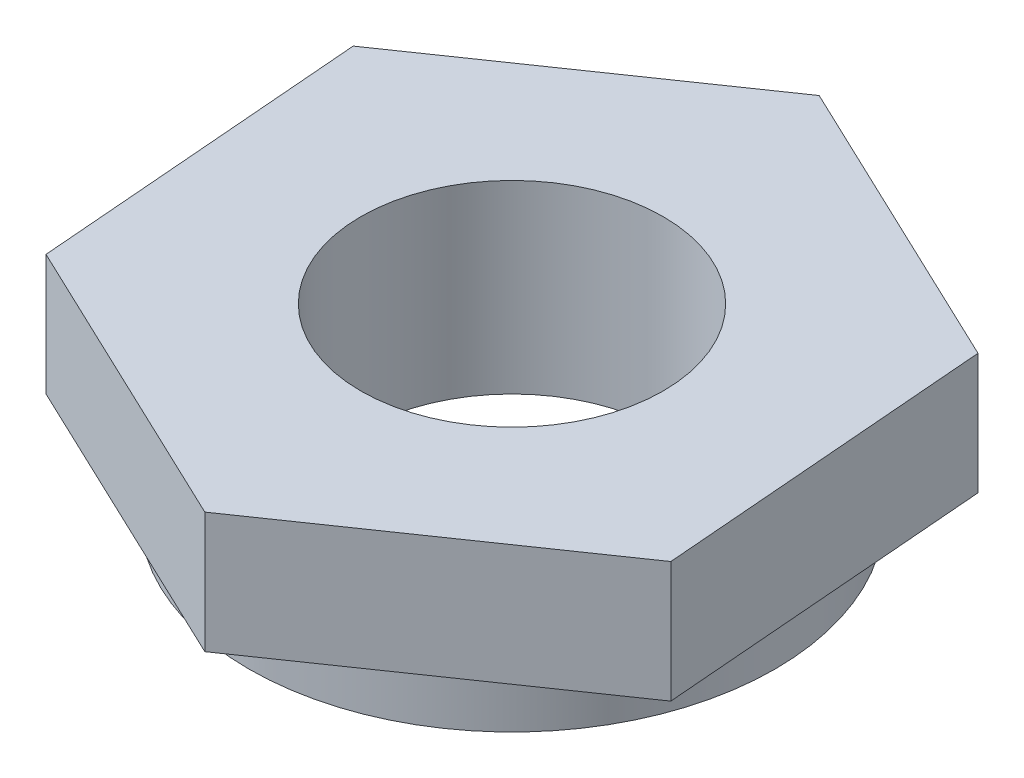
ISO-10303-21;
HEADER;
FILE_DESCRIPTION(('STEP AP214'),'2;1');
FILE_NAME('part.step','',(''),(''),'','','');
FILE_SCHEMA(('AUTOMOTIVE_DESIGN { 1 0 10303 214 1 1 1 1 }'));
ENDSEC;
DATA;
#1=APPLICATION_CONTEXT('core data for automotive mechanical design processes');
#2=APPLICATION_PROTOCOL_DEFINITION('international standard','automotive_design',2000,#1);
#3=PRODUCT_CONTEXT('',#1,'mechanical');
#4=PRODUCT('Part','Part','',(#3));
#5=PRODUCT_RELATED_PRODUCT_CATEGORY('part','',(#4));
#6=PRODUCT_DEFINITION_FORMATION('','',#4);
#7=PRODUCT_DEFINITION_CONTEXT('part definition',#1,'design');
#8=PRODUCT_DEFINITION('design','',#6,#7);
#9=PRODUCT_DEFINITION_SHAPE('','',#8);
#10=(LENGTH_UNIT() NAMED_UNIT(*) SI_UNIT(.MILLI.,.METRE.));
#11=(NAMED_UNIT(*) PLANE_ANGLE_UNIT() SI_UNIT($,.RADIAN.));
#12=(NAMED_UNIT(*) SI_UNIT($,.STERADIAN.) SOLID_ANGLE_UNIT());
#13=UNCERTAINTY_MEASURE_WITH_UNIT(LENGTH_MEASURE(1.E-05),#10,'distance_accuracy_value','');
#14=(GEOMETRIC_REPRESENTATION_CONTEXT(3) GLOBAL_UNCERTAINTY_ASSIGNED_CONTEXT((#13)) GLOBAL_UNIT_ASSIGNED_CONTEXT((#10,
#11,#12)) REPRESENTATION_CONTEXT('',''));
#15=CARTESIAN_POINT('',(0.,0.,0.));
#16=DIRECTION('',(0.,0.,1.));
#17=DIRECTION('',(1.,0.,0.));
#18=AXIS2_PLACEMENT_3D('',#15,#16,#17);
#19=CARTESIAN_POINT('',(0.221601351525087,1.,2.76240707373158));
#20=DIRECTION('',(-0.567649318486044,0.,-0.823270460554932));
#21=DIRECTION('',(-0.823270460554932,0.,0.567649318486044));
#22=AXIS2_PLACEMENT_3D('',#19,#20,#21);
#23=PLANE('',#22);
#24=DIRECTION('',(0.823270460554932,0.,-0.567649318486044));
#25=VECTOR('',#24,1.);
#26=CARTESIAN_POINT('',(0.221601351525087,0.,2.76240707373158));
#27=LINE('',#26,#25);
#28=CARTESIAN_POINT('',(0.221601351525087,0.,2.76240707373158));
#29=VERTEX_POINT('',#28);
#30=CARTESIAN_POINT('',(2.50311537720792,0.,1.1892911369321));
#31=VERTEX_POINT('',#30);
#32=EDGE_CURVE('E121',#29,#31,#27,.T.);
#33=ORIENTED_EDGE('',*,*,#32,.T.);
#34=DIRECTION('',(0.,-1.,0.));
#35=VECTOR('',#34,1.);
#36=CARTESIAN_POINT('',(2.50311537720792,1.,1.1892911369321));
#37=LINE('',#36,#35);
#38=CARTESIAN_POINT('',(2.50311537720792,1.,1.1892911369321));
#39=VERTEX_POINT('',#38);
#40=EDGE_CURVE('E38',#39,#31,#37,.T.);
#41=ORIENTED_EDGE('',*,*,#40,.F.);
#42=DIRECTION('',(0.823270460554932,0.,-0.567649318486044));
#43=VECTOR('',#42,1.);
#44=CARTESIAN_POINT('',(0.221601351525087,1.,2.76240707373158));
#45=LINE('',#44,#43);
#46=CARTESIAN_POINT('',(0.221601351525087,1.,2.76240707373158));
#47=VERTEX_POINT('',#46);
#48=EDGE_CURVE('E132',#47,#39,#45,.T.);
#49=ORIENTED_EDGE('',*,*,#48,.F.);
#50=DIRECTION('',(0.,-1.,0.));
#51=VECTOR('',#50,1.);
#52=CARTESIAN_POINT('',(0.221601351525087,1.,2.76240707373158));
#53=LINE('',#52,#51);
#54=EDGE_CURVE('E117',#47,#29,#53,.T.);
#55=ORIENTED_EDGE('',*,*,#54,.T.);
#56=EDGE_LOOP('',(#33,#41,#49,#55));
#57=FACE_BOUND('',#56,.T.);
#58=ADVANCED_FACE('F35',(#57),#23,.F.);
#59=CARTESIAN_POINT('',(2.50311537720792,1.,1.1892911369321));
#60=DIRECTION('',(-0.996797792268908,0.,0.0799634999723713));
#61=DIRECTION('',(0.0799634999723713,0.,0.996797792268908));
#62=AXIS2_PLACEMENT_3D('',#59,#60,#61);
#63=PLANE('',#62);
#64=DIRECTION('',(-0.0799634999723713,0.,-0.996797792268908));
#65=VECTOR('',#64,1.);
#66=CARTESIAN_POINT('',(2.50311537720792,0.,1.1892911369321));
#67=LINE('',#66,#65);
#68=CARTESIAN_POINT('',(2.28151402568283,0.,-1.57311593679948));
#69=VERTEX_POINT('',#68);
#70=EDGE_CURVE('E124',#31,#69,#67,.T.);
#71=ORIENTED_EDGE('',*,*,#70,.T.);
#72=DIRECTION('',(0.,-1.,0.));
#73=VECTOR('',#72,1.);
#74=CARTESIAN_POINT('',(2.28151402568283,1.,-1.57311593679948));
#75=LINE('',#74,#73);
#76=CARTESIAN_POINT('',(2.28151402568283,1.,-1.57311593679948));
#77=VERTEX_POINT('',#76);
#78=EDGE_CURVE('E135',#77,#69,#75,.T.);
#79=ORIENTED_EDGE('',*,*,#78,.F.);
#80=DIRECTION('',(-0.0799634999723713,0.,-0.996797792268908));
#81=VECTOR('',#80,1.);
#82=CARTESIAN_POINT('',(2.50311537720792,1.,1.1892911369321));
#83=LINE('',#82,#81);
#84=EDGE_CURVE('E90',#39,#77,#83,.T.);
#85=ORIENTED_EDGE('',*,*,#84,.F.);
#86=ORIENTED_EDGE('',*,*,#40,.T.);
#87=EDGE_LOOP('',(#71,#79,#85,#86));
#88=FACE_BOUND('',#87,.T.);
#89=ADVANCED_FACE('F140',(#88),#63,.F.);
#90=CARTESIAN_POINT('',(2.28151402568283,1.,-1.57311593679948));
#91=DIRECTION('',(-0.429148473782864,0.,0.903233960527303));
#92=DIRECTION('',(0.903233960527304,0.,0.429148473782864));
#93=AXIS2_PLACEMENT_3D('',#90,#91,#92);
#94=PLANE('',#93);
#95=DIRECTION('',(-0.903233960527303,0.,-0.429148473782864));
#96=VECTOR('',#95,1.);
#97=CARTESIAN_POINT('',(2.28151402568283,0.,-1.57311593679948));
#98=LINE('',#97,#96);
#99=CARTESIAN_POINT('',(-0.221601351525087,0.,-2.76240707373158));
#100=VERTEX_POINT('',#99);
#101=EDGE_CURVE('E127',#69,#100,#98,.T.);
#102=ORIENTED_EDGE('',*,*,#101,.T.);
#103=DIRECTION('',(0.,-1.,0.));
#104=VECTOR('',#103,1.);
#105=CARTESIAN_POINT('',(-0.221601351525087,1.,-2.76240707373158));
#106=LINE('',#105,#104);
#107=CARTESIAN_POINT('',(-0.221601351525087,1.,-2.76240707373158));
#108=VERTEX_POINT('',#107);
#109=EDGE_CURVE('E112',#108,#100,#106,.T.);
#110=ORIENTED_EDGE('',*,*,#109,.F.);
#111=DIRECTION('',(-0.903233960527303,0.,-0.429148473782864));
#112=VECTOR('',#111,1.);
#113=CARTESIAN_POINT('',(2.28151402568283,1.,-1.57311593679948));
#114=LINE('',#113,#112);
#115=EDGE_CURVE('E103',#77,#108,#114,.T.);
#116=ORIENTED_EDGE('',*,*,#115,.F.);
#117=ORIENTED_EDGE('',*,*,#78,.T.);
#118=EDGE_LOOP('',(#102,#110,#116,#117));
#119=FACE_BOUND('',#118,.T.);
#120=ADVANCED_FACE('F146',(#119),#94,.F.);
#121=CARTESIAN_POINT('',(-0.221601351525087,1.,-2.76240707373158));
#122=DIRECTION('',(0.567649318486044,0.,0.823270460554932));
#123=DIRECTION('',(0.823270460554932,0.,-0.567649318486044));
#124=AXIS2_PLACEMENT_3D('',#121,#122,#123);
#125=PLANE('',#124);
#126=DIRECTION('',(-0.823270460554932,0.,0.567649318486044));
#127=VECTOR('',#126,1.);
#128=CARTESIAN_POINT('',(-0.221601351525087,0.,-2.76240707373158));
#129=LINE('',#128,#127);
#130=CARTESIAN_POINT('',(-2.50311537720792,0.,-1.1892911369321));
#131=VERTEX_POINT('',#130);
#132=EDGE_CURVE('E111',#100,#131,#129,.T.);
#133=ORIENTED_EDGE('',*,*,#132,.T.);
#134=DIRECTION('',(0.,-1.,0.));
#135=VECTOR('',#134,1.);
#136=CARTESIAN_POINT('',(-2.50311537720792,1.,-1.1892911369321));
#137=LINE('',#136,#135);
#138=CARTESIAN_POINT('',(-2.50311537720792,1.,-1.1892911369321));
#139=VERTEX_POINT('',#138);
#140=EDGE_CURVE('E108',#139,#131,#137,.T.);
#141=ORIENTED_EDGE('',*,*,#140,.F.);
#142=DIRECTION('',(-0.823270460554932,0.,0.567649318486044));
#143=VECTOR('',#142,1.);
#144=CARTESIAN_POINT('',(-0.221601351525087,1.,-2.76240707373158));
#145=LINE('',#144,#143);
#146=EDGE_CURVE('E97',#108,#139,#145,.T.);
#147=ORIENTED_EDGE('',*,*,#146,.F.);
#148=ORIENTED_EDGE('',*,*,#109,.T.);
#149=EDGE_LOOP('',(#133,#141,#147,#148));
#150=FACE_BOUND('',#149,.T.);
#151=ADVANCED_FACE('F109',(#150),#125,.F.);
#152=CARTESIAN_POINT('',(-2.50311537720792,1.,-1.1892911369321));
#153=DIRECTION('',(0.996797792268908,0.,-0.0799634999723711));
#154=DIRECTION('',(-0.0799634999723711,0.,-0.996797792268908));
#155=AXIS2_PLACEMENT_3D('',#152,#153,#154);
#156=PLANE('',#155);
#157=DIRECTION('',(0.0799634999723711,0.,0.996797792268908));
#158=VECTOR('',#157,1.);
#159=CARTESIAN_POINT('',(-2.50311537720792,0.,-1.1892911369321));
#160=LINE('',#159,#158);
#161=CARTESIAN_POINT('',(-2.28151402568284,0.,1.57311593679948));
#162=VERTEX_POINT('',#161);
#163=EDGE_CURVE('E75',#131,#162,#160,.T.);
#164=ORIENTED_EDGE('',*,*,#163,.T.);
#165=DIRECTION('',(0.,-1.,0.));
#166=VECTOR('',#165,1.);
#167=CARTESIAN_POINT('',(-2.28151402568284,1.,1.57311593679948));
#168=LINE('',#167,#166);
#169=CARTESIAN_POINT('',(-2.28151402568284,1.,1.57311593679948));
#170=VERTEX_POINT('',#169);
#171=EDGE_CURVE('E113',#170,#162,#168,.T.);
#172=ORIENTED_EDGE('',*,*,#171,.F.);
#173=DIRECTION('',(0.0799634999723711,0.,0.996797792268908));
#174=VECTOR('',#173,1.);
#175=CARTESIAN_POINT('',(-2.50311537720792,1.,-1.1892911369321));
#176=LINE('',#175,#174);
#177=EDGE_CURVE('E101',#139,#170,#176,.T.);
#178=ORIENTED_EDGE('',*,*,#177,.F.);
#179=ORIENTED_EDGE('',*,*,#140,.T.);
#180=EDGE_LOOP('',(#164,#172,#178,#179));
#181=FACE_BOUND('',#180,.T.);
#182=ADVANCED_FACE('F115',(#181),#156,.F.);
#183=CARTESIAN_POINT('',(-2.28151402568284,1.,1.57311593679948));
#184=DIRECTION('',(0.429148473782864,0.,-0.903233960527303));
#185=DIRECTION('',(-0.903233960527303,0.,-0.429148473782864));
#186=AXIS2_PLACEMENT_3D('',#183,#184,#185);
#187=PLANE('',#186);
#188=DIRECTION('',(0.903233960527303,0.,0.429148473782864));
#189=VECTOR('',#188,1.);
#190=CARTESIAN_POINT('',(-2.28151402568284,0.,1.57311593679948));
#191=LINE('',#190,#189);
#192=EDGE_CURVE('E81',#162,#29,#191,.T.);
#193=ORIENTED_EDGE('',*,*,#192,.T.);
#194=ORIENTED_EDGE('',*,*,#54,.F.);
#195=DIRECTION('',(0.903233960527303,0.,0.429148473782864));
#196=VECTOR('',#195,1.);
#197=CARTESIAN_POINT('',(-2.28151402568284,1.,1.57311593679948));
#198=LINE('',#197,#196);
#199=EDGE_CURVE('E52',#170,#47,#198,.T.);
#200=ORIENTED_EDGE('',*,*,#199,.F.);
#201=ORIENTED_EDGE('',*,*,#171,.T.);
#202=EDGE_LOOP('',(#193,#194,#200,#201));
#203=FACE_BOUND('',#202,.T.);
#204=ADVANCED_FACE('F183',(#203),#187,.F.);
#205=CARTESIAN_POINT('',(0.,1.,0.));
#206=DIRECTION('',(0.,1.,0.));
#207=DIRECTION('',(0.,0.,1.));
#208=AXIS2_PLACEMENT_3D('',#205,#206,#207);
#209=PLANE('',#208);
#210=CARTESIAN_POINT('',(0.,1.,0.));
#211=DIRECTION('',(0.,-1.,0.));
#212=DIRECTION('',(0.,0.,-1.));
#213=AXIS2_PLACEMENT_3D('',#210,#211,#212);
#214=CIRCLE('',#213,1.25);
#215=CARTESIAN_POINT('',(0.,1.,-1.25));
#216=VERTEX_POINT('',#215);
#217=EDGE_CURVE('E152',#216,#216,#214,.T.);
#218=ORIENTED_EDGE('',*,*,#217,.T.);
#219=EDGE_LOOP('',(#218));
#220=FACE_BOUND('',#219,.T.);
#221=ORIENTED_EDGE('',*,*,#48,.T.);
#222=ORIENTED_EDGE('',*,*,#84,.T.);
#223=ORIENTED_EDGE('',*,*,#115,.T.);
#224=ORIENTED_EDGE('',*,*,#146,.T.);
#225=ORIENTED_EDGE('',*,*,#177,.T.);
#226=ORIENTED_EDGE('',*,*,#199,.T.);
#227=EDGE_LOOP('',(#221,#222,#223,#224,#225,#226));
#228=FACE_BOUND('',#227,.T.);
#229=ADVANCED_FACE('F99',(#220,#228),#209,.T.);
#230=CARTESIAN_POINT('',(0.,0.,0.));
#231=DIRECTION('',(0.,1.,0.));
#232=DIRECTION('',(0.,0.,1.));
#233=AXIS2_PLACEMENT_3D('',#230,#231,#232);
#234=PLANE('',#233);
#235=CARTESIAN_POINT('',(0.,0.,0.));
#236=DIRECTION('',(0.,-1.,0.));
#237=DIRECTION('',(0.,0.,-1.));
#238=AXIS2_PLACEMENT_3D('',#235,#236,#237);
#239=CIRCLE('',#238,2.175);
#240=CARTESIAN_POINT('',(0.,0.,-2.175));
#241=VERTEX_POINT('',#240);
#242=EDGE_CURVE('E11',#241,#241,#239,.T.);
#243=ORIENTED_EDGE('',*,*,#242,.F.);
#244=EDGE_LOOP('',(#243));
#245=FACE_BOUND('',#244,.T.);
#246=ORIENTED_EDGE('',*,*,#32,.F.);
#247=ORIENTED_EDGE('',*,*,#192,.F.);
#248=ORIENTED_EDGE('',*,*,#163,.F.);
#249=ORIENTED_EDGE('',*,*,#132,.F.);
#250=ORIENTED_EDGE('',*,*,#101,.F.);
#251=ORIENTED_EDGE('',*,*,#70,.F.);
#252=EDGE_LOOP('',(#246,#247,#248,#249,#250,#251));
#253=FACE_BOUND('',#252,.T.);
#254=ADVANCED_FACE('F145',(#245,#253),#234,.F.);
#255=CARTESIAN_POINT('',(0.,-0.53,0.));
#256=DIRECTION('',(0.,1.,0.));
#257=DIRECTION('',(0.,0.,1.));
#258=AXIS2_PLACEMENT_3D('',#255,#256,#257);
#259=CYLINDRICAL_SURFACE('',#258,2.175);
#260=CARTESIAN_POINT('',(0.,-0.53,0.));
#261=DIRECTION('',(0.,-1.,0.));
#262=DIRECTION('',(0.,0.,-1.));
#263=AXIS2_PLACEMENT_3D('',#260,#261,#262);
#264=CIRCLE('',#263,2.175);
#265=CARTESIAN_POINT('',(0.,-0.53,-2.175));
#266=VERTEX_POINT('',#265);
#267=EDGE_CURVE('E125',#266,#266,#264,.T.);
#268=ORIENTED_EDGE('',*,*,#267,.F.);
#269=EDGE_LOOP('',(#268));
#270=FACE_BOUND('',#269,.T.);
#271=ORIENTED_EDGE('',*,*,#242,.T.);
#272=EDGE_LOOP('',(#271));
#273=FACE_BOUND('',#272,.T.);
#274=ADVANCED_FACE('F169',(#270,#273),#259,.T.);
#275=CARTESIAN_POINT('',(0.,-0.53,0.));
#276=DIRECTION('',(0.,-1.,0.));
#277=DIRECTION('',(0.,0.,-1.));
#278=AXIS2_PLACEMENT_3D('',#275,#276,#277);
#279=PLANE('',#278);
#280=CARTESIAN_POINT('',(0.,-0.53,0.));
#281=DIRECTION('',(0.,-1.,0.));
#282=DIRECTION('',(0.,0.,-1.));
#283=AXIS2_PLACEMENT_3D('',#280,#281,#282);
#284=CIRCLE('',#283,1.25);
#285=CARTESIAN_POINT('',(0.,-0.53,-1.25));
#286=VERTEX_POINT('',#285);
#287=EDGE_CURVE('E153',#286,#286,#284,.T.);
#288=ORIENTED_EDGE('',*,*,#287,.F.);
#289=EDGE_LOOP('',(#288));
#290=FACE_BOUND('',#289,.T.);
#291=ORIENTED_EDGE('',*,*,#267,.T.);
#292=EDGE_LOOP('',(#291));
#293=FACE_BOUND('',#292,.T.);
#294=ADVANCED_FACE('F163',(#290,#293),#279,.T.);
#295=CARTESIAN_POINT('',(0.,1.,0.));
#296=DIRECTION('',(0.,-1.,0.));
#297=DIRECTION('',(0.,0.,-1.));
#298=AXIS2_PLACEMENT_3D('',#295,#296,#297);
#299=CYLINDRICAL_SURFACE('',#298,1.25);
#300=ORIENTED_EDGE('',*,*,#217,.F.);
#301=EDGE_LOOP('',(#300));
#302=FACE_BOUND('',#301,.T.);
#303=ORIENTED_EDGE('',*,*,#287,.T.);
#304=EDGE_LOOP('',(#303));
#305=FACE_BOUND('',#304,.T.);
#306=ADVANCED_FACE('F160',(#302,#305),#299,.F.);
#307=CLOSED_SHELL('',(#58,#89,#120,#151,#182,#204,#229,#254,#274,#294,#306));
#308=MANIFOLD_SOLID_BREP('B2',#307);
#309=ADVANCED_BREP_SHAPE_REPRESENTATION('',(#18,#308),#14);
#310=SHAPE_DEFINITION_REPRESENTATION(#9,#309);
ENDSEC;
END-ISO-10303-21;
